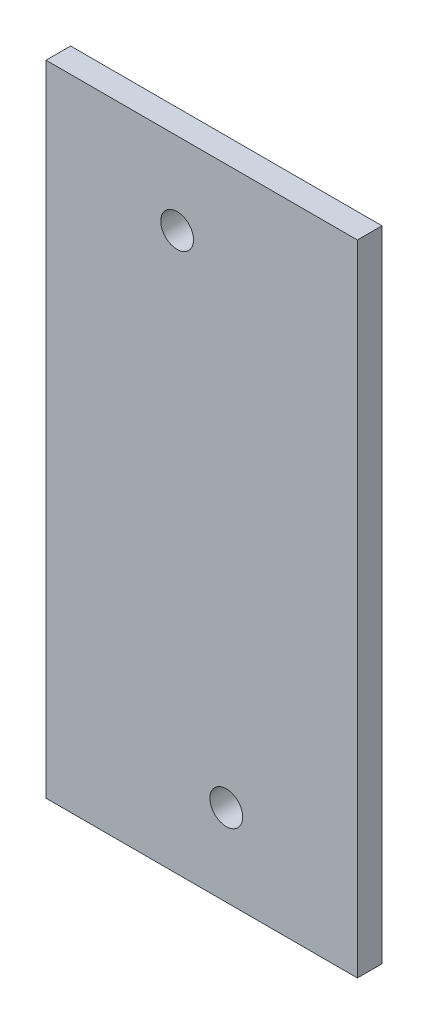
ISO-10303-21;
HEADER;
FILE_DESCRIPTION(('STEP AP214'),'2;1');
FILE_NAME('part.step','',(''),(''),'','','');
FILE_SCHEMA(('AUTOMOTIVE_DESIGN { 1 0 10303 214 1 1 1 1 }'));
ENDSEC;
DATA;
#1=APPLICATION_CONTEXT('core data for automotive mechanical design processes');
#2=APPLICATION_PROTOCOL_DEFINITION('international standard','automotive_design',2000,#1);
#3=PRODUCT_CONTEXT('',#1,'mechanical');
#4=PRODUCT('Part','Part','',(#3));
#5=PRODUCT_RELATED_PRODUCT_CATEGORY('part','',(#4));
#6=PRODUCT_DEFINITION_FORMATION('','',#4);
#7=PRODUCT_DEFINITION_CONTEXT('part definition',#1,'design');
#8=PRODUCT_DEFINITION('design','',#6,#7);
#9=PRODUCT_DEFINITION_SHAPE('','',#8);
#10=(LENGTH_UNIT() NAMED_UNIT(*) SI_UNIT(.MILLI.,.METRE.));
#11=(NAMED_UNIT(*) PLANE_ANGLE_UNIT() SI_UNIT($,.RADIAN.));
#12=(NAMED_UNIT(*) SI_UNIT($,.STERADIAN.) SOLID_ANGLE_UNIT());
#13=UNCERTAINTY_MEASURE_WITH_UNIT(LENGTH_MEASURE(1.E-05),#10,'distance_accuracy_value','');
#14=(GEOMETRIC_REPRESENTATION_CONTEXT(3) GLOBAL_UNCERTAINTY_ASSIGNED_CONTEXT((#13)) GLOBAL_UNIT_ASSIGNED_CONTEXT((#10,
#11,#12)) REPRESENTATION_CONTEXT('',''));
#15=CARTESIAN_POINT('',(0.,0.,0.));
#16=DIRECTION('',(0.,0.,1.));
#17=DIRECTION('',(1.,0.,0.));
#18=AXIS2_PLACEMENT_3D('',#15,#16,#17);
#19=CARTESIAN_POINT('',(57.,165.,3.));
#20=DIRECTION('',(1.,0.,0.));
#21=DIRECTION('',(0.,1.,0.));
#22=AXIS2_PLACEMENT_3D('',#19,#20,#21);
#23=PLANE('',#22);
#24=DIRECTION('',(0.,-1.,0.));
#25=VECTOR('',#24,1.);
#26=CARTESIAN_POINT('',(57.,165.,0.));
#27=LINE('',#26,#25);
#28=CARTESIAN_POINT('',(57.,165.,0.));
#29=VERTEX_POINT('',#28);
#30=CARTESIAN_POINT('',(57.,87.,0.));
#31=VERTEX_POINT('',#30);
#32=EDGE_CURVE('E86',#29,#31,#27,.T.);
#33=ORIENTED_EDGE('',*,*,#32,.T.);
#34=DIRECTION('',(0.,0.,1.));
#35=VECTOR('',#34,1.);
#36=CARTESIAN_POINT('',(57.,87.,-0.00100000000000013));
#37=LINE('',#36,#35);
#38=CARTESIAN_POINT('',(57.,87.,3.));
#39=VERTEX_POINT('',#38);
#40=EDGE_CURVE('E52',#31,#39,#37,.T.);
#41=ORIENTED_EDGE('',*,*,#40,.T.);
#42=DIRECTION('',(0.,-1.,0.));
#43=VECTOR('',#42,1.);
#44=CARTESIAN_POINT('',(57.,165.,3.));
#45=LINE('',#44,#43);
#46=CARTESIAN_POINT('',(57.,165.,3.));
#47=VERTEX_POINT('',#46);
#48=EDGE_CURVE('E81',#47,#39,#45,.T.);
#49=ORIENTED_EDGE('',*,*,#48,.F.);
#50=DIRECTION('',(0.,0.,-1.));
#51=VECTOR('',#50,1.);
#52=CARTESIAN_POINT('',(57.,165.,3.));
#53=LINE('',#52,#51);
#54=EDGE_CURVE('E45',#47,#29,#53,.T.);
#55=ORIENTED_EDGE('',*,*,#54,.T.);
#56=EDGE_LOOP('',(#33,#41,#49,#55));
#57=FACE_BOUND('',#56,.T.);
#58=ADVANCED_FACE('F38',(#57),#23,.F.);
#59=CARTESIAN_POINT('',(95.,165.,3.));
#60=DIRECTION('',(-1.,0.,0.));
#61=DIRECTION('',(0.,-1.,0.));
#62=AXIS2_PLACEMENT_3D('',#59,#60,#61);
#63=PLANE('',#62);
#64=DIRECTION('',(0.,1.,0.));
#65=VECTOR('',#64,1.);
#66=CARTESIAN_POINT('',(95.,165.,3.));
#67=LINE('',#66,#65);
#68=CARTESIAN_POINT('',(95.,87.,3.));
#69=VERTEX_POINT('',#68);
#70=CARTESIAN_POINT('',(95.,165.,3.));
#71=VERTEX_POINT('',#70);
#72=EDGE_CURVE('E98',#69,#71,#67,.T.);
#73=ORIENTED_EDGE('',*,*,#72,.F.);
#74=DIRECTION('',(0.,0.,1.));
#75=VECTOR('',#74,1.);
#76=CARTESIAN_POINT('',(95.,87.,-0.00100000000000013));
#77=LINE('',#76,#75);
#78=CARTESIAN_POINT('',(95.,87.,0.));
#79=VERTEX_POINT('',#78);
#80=EDGE_CURVE('E109',#79,#69,#77,.T.);
#81=ORIENTED_EDGE('',*,*,#80,.F.);
#82=DIRECTION('',(0.,1.,0.));
#83=VECTOR('',#82,1.);
#84=CARTESIAN_POINT('',(95.,165.,0.));
#85=LINE('',#84,#83);
#86=CARTESIAN_POINT('',(95.,165.,0.));
#87=VERTEX_POINT('',#86);
#88=EDGE_CURVE('E82',#79,#87,#85,.T.);
#89=ORIENTED_EDGE('',*,*,#88,.T.);
#90=DIRECTION('',(0.,0.,-1.));
#91=VECTOR('',#90,1.);
#92=CARTESIAN_POINT('',(95.,165.,3.));
#93=LINE('',#92,#91);
#94=EDGE_CURVE('E11',#71,#87,#93,.T.);
#95=ORIENTED_EDGE('',*,*,#94,.F.);
#96=EDGE_LOOP('',(#73,#81,#89,#95));
#97=FACE_BOUND('',#96,.T.);
#98=ADVANCED_FACE('F132',(#97),#63,.F.);
#99=CARTESIAN_POINT('',(57.,165.,3.));
#100=DIRECTION('',(0.,-1.,0.));
#101=DIRECTION('',(0.,0.,-1.));
#102=AXIS2_PLACEMENT_3D('',#99,#100,#101);
#103=PLANE('',#102);
#104=DIRECTION('',(-1.,0.,0.));
#105=VECTOR('',#104,1.);
#106=CARTESIAN_POINT('',(57.,165.,0.));
#107=LINE('',#106,#105);
#108=EDGE_CURVE('E73',#87,#29,#107,.T.);
#109=ORIENTED_EDGE('',*,*,#108,.T.);
#110=ORIENTED_EDGE('',*,*,#54,.F.);
#111=DIRECTION('',(-1.,0.,0.));
#112=VECTOR('',#111,1.);
#113=CARTESIAN_POINT('',(57.,165.,3.));
#114=LINE('',#113,#112);
#115=EDGE_CURVE('E61',#71,#47,#114,.T.);
#116=ORIENTED_EDGE('',*,*,#115,.F.);
#117=ORIENTED_EDGE('',*,*,#94,.T.);
#118=EDGE_LOOP('',(#109,#110,#116,#117));
#119=FACE_BOUND('',#118,.T.);
#120=ADVANCED_FACE('F75',(#119),#103,.F.);
#121=CARTESIAN_POINT('',(0.,0.,3.));
#122=DIRECTION('',(0.,0.,-1.));
#123=DIRECTION('',(-1.,0.,0.));
#124=AXIS2_PLACEMENT_3D('',#121,#122,#123);
#125=PLANE('',#124);
#126=CARTESIAN_POINT('',(73.,155.,3.));
#127=DIRECTION('',(0.,0.,1.));
#128=DIRECTION('',(1.,0.,0.));
#129=AXIS2_PLACEMENT_3D('',#126,#127,#128);
#130=CIRCLE('',#129,2.);
#131=CARTESIAN_POINT('',(75.,155.,3.));
#132=VERTEX_POINT('',#131);
#133=EDGE_CURVE('E90',#132,#132,#130,.T.);
#134=ORIENTED_EDGE('',*,*,#133,.F.);
#135=EDGE_LOOP('',(#134));
#136=FACE_BOUND('',#135,.T.);
#137=CARTESIAN_POINT('',(79.,97.,3.));
#138=DIRECTION('',(0.,0.,1.));
#139=DIRECTION('',(1.,0.,0.));
#140=AXIS2_PLACEMENT_3D('',#137,#138,#139);
#141=CIRCLE('',#140,2.);
#142=CARTESIAN_POINT('',(81.,97.,3.));
#143=VERTEX_POINT('',#142);
#144=EDGE_CURVE('E104',#143,#143,#141,.T.);
#145=ORIENTED_EDGE('',*,*,#144,.F.);
#146=EDGE_LOOP('',(#145));
#147=FACE_BOUND('',#146,.T.);
#148=ORIENTED_EDGE('',*,*,#48,.T.);
#149=DIRECTION('',(-1.,0.,0.));
#150=VECTOR('',#149,1.);
#151=CARTESIAN_POINT('',(57.,87.,3.));
#152=LINE('',#151,#150);
#153=EDGE_CURVE('E112',#69,#39,#152,.T.);
#154=ORIENTED_EDGE('',*,*,#153,.F.);
#155=ORIENTED_EDGE('',*,*,#72,.T.);
#156=ORIENTED_EDGE('',*,*,#115,.T.);
#157=EDGE_LOOP('',(#148,#154,#155,#156));
#158=FACE_BOUND('',#157,.T.);
#159=ADVANCED_FACE('F122',(#136,#147,#158),#125,.F.);
#160=CARTESIAN_POINT('',(0.,0.,0.));
#161=DIRECTION('',(0.,0.,-1.));
#162=DIRECTION('',(-1.,0.,0.));
#163=AXIS2_PLACEMENT_3D('',#160,#161,#162);
#164=PLANE('',#163);
#165=DIRECTION('',(-1.,0.,0.));
#166=VECTOR('',#165,1.);
#167=CARTESIAN_POINT('',(57.,87.,0.));
#168=LINE('',#167,#166);
#169=EDGE_CURVE('E89',#79,#31,#168,.T.);
#170=ORIENTED_EDGE('',*,*,#169,.T.);
#171=ORIENTED_EDGE('',*,*,#32,.F.);
#172=ORIENTED_EDGE('',*,*,#108,.F.);
#173=ORIENTED_EDGE('',*,*,#88,.F.);
#174=EDGE_LOOP('',(#170,#171,#172,#173));
#175=FACE_BOUND('',#174,.T.);
#176=CARTESIAN_POINT('',(73.,155.,0.));
#177=DIRECTION('',(0.,0.,-1.));
#178=DIRECTION('',(-1.,0.,0.));
#179=AXIS2_PLACEMENT_3D('',#176,#177,#178);
#180=CIRCLE('',#179,2.);
#181=CARTESIAN_POINT('',(75.,155.,0.));
#182=VERTEX_POINT('',#181);
#183=EDGE_CURVE('E94',#182,#182,#180,.F.);
#184=ORIENTED_EDGE('',*,*,#183,.T.);
#185=EDGE_LOOP('',(#184));
#186=FACE_BOUND('',#185,.T.);
#187=CARTESIAN_POINT('',(79.,97.,0.));
#188=DIRECTION('',(0.,0.,-1.));
#189=DIRECTION('',(-1.,0.,0.));
#190=AXIS2_PLACEMENT_3D('',#187,#188,#189);
#191=CIRCLE('',#190,2.);
#192=CARTESIAN_POINT('',(81.,97.,0.));
#193=VERTEX_POINT('',#192);
#194=EDGE_CURVE('E101',#193,#193,#191,.F.);
#195=ORIENTED_EDGE('',*,*,#194,.T.);
#196=EDGE_LOOP('',(#195));
#197=FACE_BOUND('',#196,.T.);
#198=ADVANCED_FACE('F87',(#175,#186,#197),#164,.T.);
#199=CARTESIAN_POINT('',(79.,97.,-0.00100000000000013));
#200=DIRECTION('',(0.,0.,1.));
#201=DIRECTION('',(1.,0.,0.));
#202=AXIS2_PLACEMENT_3D('',#199,#200,#201);
#203=CYLINDRICAL_SURFACE('',#202,2.);
#204=CARTESIAN_POINT('',(81.,97.,0.));
#205=CARTESIAN_POINT('',(81.,97.,0.03125));
#206=CARTESIAN_POINT('',(81.,97.,0.0625));
#207=CARTESIAN_POINT('',(81.,97.,0.125));
#208=CARTESIAN_POINT('',(81.,97.,0.15625));
#209=CARTESIAN_POINT('',(81.,97.,0.21875));
#210=CARTESIAN_POINT('',(81.,97.,0.25));
#211=CARTESIAN_POINT('',(81.,97.,0.3125));
#212=CARTESIAN_POINT('',(81.,97.,0.34375));
#213=CARTESIAN_POINT('',(81.,97.,0.40625));
#214=CARTESIAN_POINT('',(81.,97.,0.4375));
#215=CARTESIAN_POINT('',(81.,97.,0.5));
#216=CARTESIAN_POINT('',(81.,97.,0.53125));
#217=CARTESIAN_POINT('',(81.,97.,0.59375));
#218=CARTESIAN_POINT('',(81.,97.,0.625));
#219=CARTESIAN_POINT('',(81.,97.,0.6875));
#220=CARTESIAN_POINT('',(81.,97.,0.71875));
#221=CARTESIAN_POINT('',(81.,97.,0.78125));
#222=CARTESIAN_POINT('',(81.,97.,0.8125));
#223=CARTESIAN_POINT('',(81.,97.,0.875));
#224=CARTESIAN_POINT('',(81.,97.,0.90625));
#225=CARTESIAN_POINT('',(81.,97.,0.96875));
#226=CARTESIAN_POINT('',(81.,97.,1.));
#227=CARTESIAN_POINT('',(81.,97.,1.0625));
#228=CARTESIAN_POINT('',(81.,97.,1.09375));
#229=CARTESIAN_POINT('',(81.,97.,1.15625));
#230=CARTESIAN_POINT('',(81.,97.,1.1875));
#231=CARTESIAN_POINT('',(81.,97.,1.25));
#232=CARTESIAN_POINT('',(81.,97.,1.28125));
#233=CARTESIAN_POINT('',(81.,97.,1.34375));
#234=CARTESIAN_POINT('',(81.,97.,1.375));
#235=CARTESIAN_POINT('',(81.,97.,1.4375));
#236=CARTESIAN_POINT('',(81.,97.,1.46875));
#237=CARTESIAN_POINT('',(81.,97.,1.53125));
#238=CARTESIAN_POINT('',(81.,97.,1.5625));
#239=CARTESIAN_POINT('',(81.,97.,1.625));
#240=CARTESIAN_POINT('',(81.,97.,1.65625));
#241=CARTESIAN_POINT('',(81.,97.,1.71875));
#242=CARTESIAN_POINT('',(81.,97.,1.75));
#243=CARTESIAN_POINT('',(81.,97.,1.8125));
#244=CARTESIAN_POINT('',(81.,97.,1.84375));
#245=CARTESIAN_POINT('',(81.,97.,1.90625));
#246=CARTESIAN_POINT('',(81.,97.,1.9375));
#247=CARTESIAN_POINT('',(81.,97.,2.));
#248=CARTESIAN_POINT('',(81.,97.,2.03125));
#249=CARTESIAN_POINT('',(81.,97.,2.09375));
#250=CARTESIAN_POINT('',(81.,97.,2.125));
#251=CARTESIAN_POINT('',(81.,97.,2.1875));
#252=CARTESIAN_POINT('',(81.,97.,2.21875));
#253=CARTESIAN_POINT('',(81.,97.,2.28125));
#254=CARTESIAN_POINT('',(81.,97.,2.3125));
#255=CARTESIAN_POINT('',(81.,97.,2.375));
#256=CARTESIAN_POINT('',(81.,97.,2.40625));
#257=CARTESIAN_POINT('',(81.,97.,2.46875));
#258=CARTESIAN_POINT('',(81.,97.,2.5));
#259=CARTESIAN_POINT('',(81.,97.,2.5625));
#260=CARTESIAN_POINT('',(81.,97.,2.59375));
#261=CARTESIAN_POINT('',(81.,97.,2.65625));
#262=CARTESIAN_POINT('',(81.,97.,2.6875));
#263=CARTESIAN_POINT('',(81.,97.,2.75));
#264=CARTESIAN_POINT('',(81.,97.,2.78125));
#265=CARTESIAN_POINT('',(81.,97.,2.84375));
#266=CARTESIAN_POINT('',(81.,97.,2.875));
#267=CARTESIAN_POINT('',(81.,97.,2.9375));
#268=CARTESIAN_POINT('',(81.,97.,2.96875));
#269=CARTESIAN_POINT('',(81.,97.,3.));
#270=B_SPLINE_CURVE_WITH_KNOTS('',3,(#204,#205,#206,#207,#208,#209,#210,#211,#212,#213,#214,
#215,#216,#217,#218,#219,#220,#221,#222,#223,#224,#225,#226,#227,#228,#229,#230,#231,#232,#233,
#234,#235,#236,#237,#238,#239,#240,#241,#242,#243,#244,#245,#246,#247,#248,#249,#250,#251,#252,
#253,#254,#255,#256,#257,#258,#259,#260,#261,#262,#263,#264,#265,#266,#267,#268,#269),
.UNSPECIFIED.,.F.,.F.,(4,2,2,2,2,2,2,2,2,2,2,2,2,2,2,2,2,2,2,2,2,2,2,2,2,2,2,2,2,2,2,2,4),(0.,
0.09375,0.1875,0.28125,0.375,0.46875,0.5625,0.65625,0.75,0.84375,0.9375,1.03125,1.125,1.21875,
1.3125,1.40625,1.5,1.59375,1.6875,1.78125,1.875,1.96875,2.0625,2.15625,2.25,2.34375,2.4375,
2.53125,2.625,2.71875,2.8125,2.90625,3.),.UNSPECIFIED.);
#271=EDGE_CURVE('BSEAM129',#193,#143,#270,.T.);
#272=ORIENTED_EDGE('',*,*,#194,.F.);
#273=ORIENTED_EDGE('',*,*,#144,.T.);
#274=ORIENTED_EDGE('',*,*,#271,.T.);
#275=ORIENTED_EDGE('',*,*,#271,.F.);
#276=EDGE_LOOP('',(#272,#274,#273,#275));
#277=FACE_BOUND('',#276,.T.);
#278=ADVANCED_FACE('F129',(#277),#203,.F.);
#279=CARTESIAN_POINT('',(73.,155.,-0.00100000000000013));
#280=DIRECTION('',(0.,0.,1.));
#281=DIRECTION('',(1.,0.,0.));
#282=AXIS2_PLACEMENT_3D('',#279,#280,#281);
#283=CYLINDRICAL_SURFACE('',#282,2.);
#284=CARTESIAN_POINT('',(75.,155.,0.));
#285=CARTESIAN_POINT('',(75.,155.,0.03125));
#286=CARTESIAN_POINT('',(75.,155.,0.0625));
#287=CARTESIAN_POINT('',(75.,155.,0.125));
#288=CARTESIAN_POINT('',(75.,155.,0.15625));
#289=CARTESIAN_POINT('',(75.,155.,0.21875));
#290=CARTESIAN_POINT('',(75.,155.,0.25));
#291=CARTESIAN_POINT('',(75.,155.,0.3125));
#292=CARTESIAN_POINT('',(75.,155.,0.34375));
#293=CARTESIAN_POINT('',(75.,155.,0.40625));
#294=CARTESIAN_POINT('',(75.,155.,0.4375));
#295=CARTESIAN_POINT('',(75.,155.,0.5));
#296=CARTESIAN_POINT('',(75.,155.,0.53125));
#297=CARTESIAN_POINT('',(75.,155.,0.59375));
#298=CARTESIAN_POINT('',(75.,155.,0.625));
#299=CARTESIAN_POINT('',(75.,155.,0.6875));
#300=CARTESIAN_POINT('',(75.,155.,0.71875));
#301=CARTESIAN_POINT('',(75.,155.,0.78125));
#302=CARTESIAN_POINT('',(75.,155.,0.8125));
#303=CARTESIAN_POINT('',(75.,155.,0.875));
#304=CARTESIAN_POINT('',(75.,155.,0.90625));
#305=CARTESIAN_POINT('',(75.,155.,0.96875));
#306=CARTESIAN_POINT('',(75.,155.,1.));
#307=CARTESIAN_POINT('',(75.,155.,1.0625));
#308=CARTESIAN_POINT('',(75.,155.,1.09375));
#309=CARTESIAN_POINT('',(75.,155.,1.15625));
#310=CARTESIAN_POINT('',(75.,155.,1.1875));
#311=CARTESIAN_POINT('',(75.,155.,1.25));
#312=CARTESIAN_POINT('',(75.,155.,1.28125));
#313=CARTESIAN_POINT('',(75.,155.,1.34375));
#314=CARTESIAN_POINT('',(75.,155.,1.375));
#315=CARTESIAN_POINT('',(75.,155.,1.4375));
#316=CARTESIAN_POINT('',(75.,155.,1.46875));
#317=CARTESIAN_POINT('',(75.,155.,1.53125));
#318=CARTESIAN_POINT('',(75.,155.,1.5625));
#319=CARTESIAN_POINT('',(75.,155.,1.625));
#320=CARTESIAN_POINT('',(75.,155.,1.65625));
#321=CARTESIAN_POINT('',(75.,155.,1.71875));
#322=CARTESIAN_POINT('',(75.,155.,1.75));
#323=CARTESIAN_POINT('',(75.,155.,1.8125));
#324=CARTESIAN_POINT('',(75.,155.,1.84375));
#325=CARTESIAN_POINT('',(75.,155.,1.90625));
#326=CARTESIAN_POINT('',(75.,155.,1.9375));
#327=CARTESIAN_POINT('',(75.,155.,2.));
#328=CARTESIAN_POINT('',(75.,155.,2.03125));
#329=CARTESIAN_POINT('',(75.,155.,2.09375));
#330=CARTESIAN_POINT('',(75.,155.,2.125));
#331=CARTESIAN_POINT('',(75.,155.,2.1875));
#332=CARTESIAN_POINT('',(75.,155.,2.21875));
#333=CARTESIAN_POINT('',(75.,155.,2.28125));
#334=CARTESIAN_POINT('',(75.,155.,2.3125));
#335=CARTESIAN_POINT('',(75.,155.,2.375));
#336=CARTESIAN_POINT('',(75.,155.,2.40625));
#337=CARTESIAN_POINT('',(75.,155.,2.46875));
#338=CARTESIAN_POINT('',(75.,155.,2.5));
#339=CARTESIAN_POINT('',(75.,155.,2.5625));
#340=CARTESIAN_POINT('',(75.,155.,2.59375));
#341=CARTESIAN_POINT('',(75.,155.,2.65625));
#342=CARTESIAN_POINT('',(75.,155.,2.6875));
#343=CARTESIAN_POINT('',(75.,155.,2.75));
#344=CARTESIAN_POINT('',(75.,155.,2.78125));
#345=CARTESIAN_POINT('',(75.,155.,2.84375));
#346=CARTESIAN_POINT('',(75.,155.,2.875));
#347=CARTESIAN_POINT('',(75.,155.,2.9375));
#348=CARTESIAN_POINT('',(75.,155.,2.96875));
#349=CARTESIAN_POINT('',(75.,155.,3.));
#350=B_SPLINE_CURVE_WITH_KNOTS('',3,(#284,#285,#286,#287,#288,#289,#290,#291,#292,#293,#294,
#295,#296,#297,#298,#299,#300,#301,#302,#303,#304,#305,#306,#307,#308,#309,#310,#311,#312,#313,
#314,#315,#316,#317,#318,#319,#320,#321,#322,#323,#324,#325,#326,#327,#328,#329,#330,#331,#332,
#333,#334,#335,#336,#337,#338,#339,#340,#341,#342,#343,#344,#345,#346,#347,#348,#349),
.UNSPECIFIED.,.F.,.F.,(4,2,2,2,2,2,2,2,2,2,2,2,2,2,2,2,2,2,2,2,2,2,2,2,2,2,2,2,2,2,2,2,4),(0.,
0.09375,0.1875,0.28125,0.375,0.46875,0.5625,0.65625,0.75,0.84375,0.9375,1.03125,1.125,1.21875,
1.3125,1.40625,1.5,1.59375,1.6875,1.78125,1.875,1.96875,2.0625,2.15625,2.25,2.34375,2.4375,
2.53125,2.625,2.71875,2.8125,2.90625,3.),.UNSPECIFIED.);
#351=EDGE_CURVE('BSEAM163',#182,#132,#350,.T.);
#352=ORIENTED_EDGE('',*,*,#183,.F.);
#353=ORIENTED_EDGE('',*,*,#133,.T.);
#354=ORIENTED_EDGE('',*,*,#351,.T.);
#355=ORIENTED_EDGE('',*,*,#351,.F.);
#356=EDGE_LOOP('',(#352,#354,#353,#355));
#357=FACE_BOUND('',#356,.T.);
#358=ADVANCED_FACE('F163',(#357),#283,.F.);
#359=CARTESIAN_POINT('',(57.,87.,-0.00100000000000013));
#360=DIRECTION('',(0.,1.,0.));
#361=DIRECTION('',(0.,0.,1.));
#362=AXIS2_PLACEMENT_3D('',#359,#360,#361);
#363=PLANE('',#362);
#364=ORIENTED_EDGE('',*,*,#80,.T.);
#365=ORIENTED_EDGE('',*,*,#153,.T.);
#366=ORIENTED_EDGE('',*,*,#40,.F.);
#367=ORIENTED_EDGE('',*,*,#169,.F.);
#368=EDGE_LOOP('',(#364,#365,#366,#367));
#369=FACE_BOUND('',#368,.T.);
#370=ADVANCED_FACE('F117',(#369),#363,.F.);
#371=CLOSED_SHELL('',(#58,#98,#120,#159,#198,#278,#358,#370));
#372=MANIFOLD_SOLID_BREP('B2',#371);
#373=ADVANCED_BREP_SHAPE_REPRESENTATION('',(#18,#372),#14);
#374=SHAPE_DEFINITION_REPRESENTATION(#9,#373);
ENDSEC;
END-ISO-10303-21;
